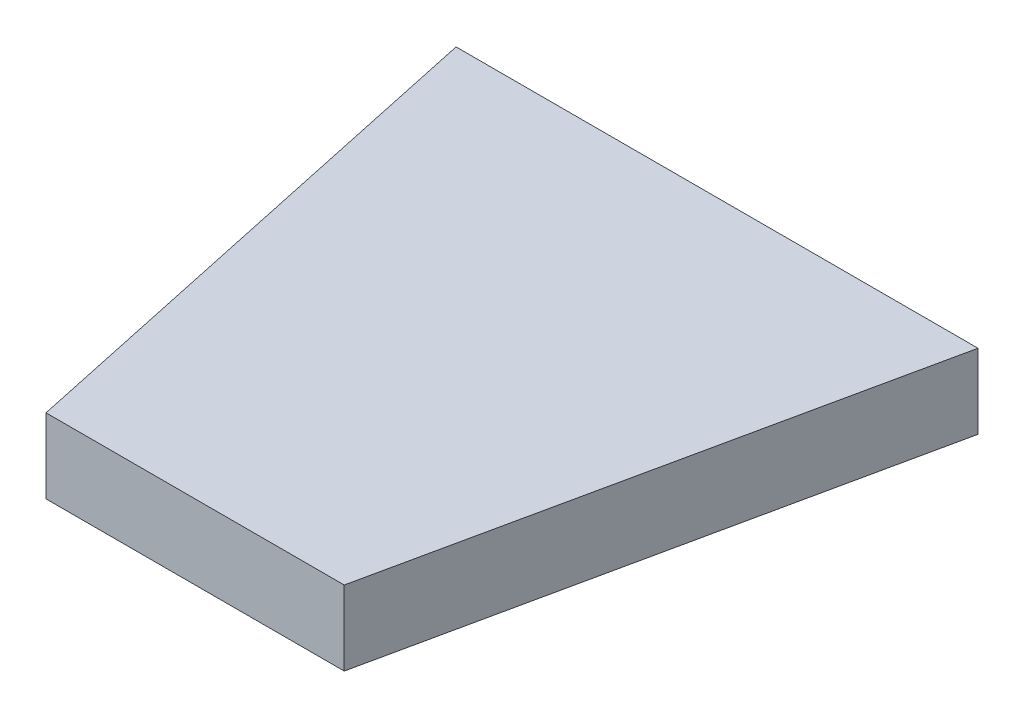
ISO-10303-21;
HEADER;
FILE_DESCRIPTION(('STEP AP214'),'2;1');
FILE_NAME('part.step','',(''),(''),'','','');
FILE_SCHEMA(('AUTOMOTIVE_DESIGN { 1 0 10303 214 1 1 1 1 }'));
ENDSEC;
DATA;
#1=APPLICATION_CONTEXT('core data for automotive mechanical design processes');
#2=APPLICATION_PROTOCOL_DEFINITION('international standard','automotive_design',2000,#1);
#3=PRODUCT_CONTEXT('',#1,'mechanical');
#4=PRODUCT('Part','Part','',(#3));
#5=PRODUCT_RELATED_PRODUCT_CATEGORY('part','',(#4));
#6=PRODUCT_DEFINITION_FORMATION('','',#4);
#7=PRODUCT_DEFINITION_CONTEXT('part definition',#1,'design');
#8=PRODUCT_DEFINITION('design','',#6,#7);
#9=PRODUCT_DEFINITION_SHAPE('','',#8);
#10=(LENGTH_UNIT() NAMED_UNIT(*) SI_UNIT(.MILLI.,.METRE.));
#11=(NAMED_UNIT(*) PLANE_ANGLE_UNIT() SI_UNIT($,.RADIAN.));
#12=(NAMED_UNIT(*) SI_UNIT($,.STERADIAN.) SOLID_ANGLE_UNIT());
#13=UNCERTAINTY_MEASURE_WITH_UNIT(LENGTH_MEASURE(1.E-05),#10,'distance_accuracy_value','');
#14=(GEOMETRIC_REPRESENTATION_CONTEXT(3) GLOBAL_UNCERTAINTY_ASSIGNED_CONTEXT((#13)) GLOBAL_UNIT_ASSIGNED_CONTEXT((#10,
#11,#12)) REPRESENTATION_CONTEXT('',''));
#15=CARTESIAN_POINT('',(0.,0.,0.));
#16=DIRECTION('',(0.,0.,1.));
#17=DIRECTION('',(1.,0.,0.));
#18=AXIS2_PLACEMENT_3D('',#15,#16,#17);
#19=CARTESIAN_POINT('',(35.,10.,-35.));
#20=DIRECTION('',(0.,0.,1.));
#21=DIRECTION('',(1.,0.,0.));
#22=AXIS2_PLACEMENT_3D('',#19,#20,#21);
#23=PLANE('',#22);
#24=DIRECTION('',(-1.,0.,0.));
#25=VECTOR('',#24,1.);
#26=CARTESIAN_POINT('',(35.,0.,-35.));
#27=LINE('',#26,#25);
#28=CARTESIAN_POINT('',(35.,0.,-35.));
#29=VERTEX_POINT('',#28);
#30=CARTESIAN_POINT('',(-35.,0.,-35.));
#31=VERTEX_POINT('',#30);
#32=EDGE_CURVE('E96',#29,#31,#27,.T.);
#33=ORIENTED_EDGE('',*,*,#32,.T.);
#34=DIRECTION('',(0.,-1.,0.));
#35=VECTOR('',#34,1.);
#36=CARTESIAN_POINT('',(-35.,10.,-35.));
#37=LINE('',#36,#35);
#38=CARTESIAN_POINT('',(-35.,10.,-35.));
#39=VERTEX_POINT('',#38);
#40=EDGE_CURVE('E11',#39,#31,#37,.T.);
#41=ORIENTED_EDGE('',*,*,#40,.F.);
#42=DIRECTION('',(-1.,0.,0.));
#43=VECTOR('',#42,1.);
#44=CARTESIAN_POINT('',(35.,10.,-35.));
#45=LINE('',#44,#43);
#46=CARTESIAN_POINT('',(35.,10.,-35.));
#47=VERTEX_POINT('',#46);
#48=EDGE_CURVE('E84',#47,#39,#45,.T.);
#49=ORIENTED_EDGE('',*,*,#48,.F.);
#50=DIRECTION('',(0.,-1.,0.));
#51=VECTOR('',#50,1.);
#52=CARTESIAN_POINT('',(35.,10.,-35.));
#53=LINE('',#52,#51);
#54=EDGE_CURVE('E92',#47,#29,#53,.T.);
#55=ORIENTED_EDGE('',*,*,#54,.T.);
#56=EDGE_LOOP('',(#33,#41,#49,#55));
#57=FACE_BOUND('',#56,.T.);
#58=ADVANCED_FACE('F33',(#57),#23,.F.);
#59=CARTESIAN_POINT('',(-35.,10.,-35.));
#60=DIRECTION('',(0.97780241407741,0.,-0.209529088730874));
#61=DIRECTION('',(-0.209529088730874,0.,-0.97780241407741));
#62=AXIS2_PLACEMENT_3D('',#59,#60,#61);
#63=PLANE('',#62);
#64=DIRECTION('',(0.209529088730874,0.,0.97780241407741));
#65=VECTOR('',#64,1.);
#66=CARTESIAN_POINT('',(-35.,0.,-35.));
#67=LINE('',#66,#65);
#68=CARTESIAN_POINT('',(-20.,0.,35.));
#69=VERTEX_POINT('',#68);
#70=EDGE_CURVE('E88',#31,#69,#67,.T.);
#71=ORIENTED_EDGE('',*,*,#70,.T.);
#72=DIRECTION('',(0.,-1.,0.));
#73=VECTOR('',#72,1.);
#74=CARTESIAN_POINT('',(-20.,10.,35.));
#75=LINE('',#74,#73);
#76=CARTESIAN_POINT('',(-20.,10.,35.));
#77=VERTEX_POINT('',#76);
#78=EDGE_CURVE('E41',#77,#69,#75,.T.);
#79=ORIENTED_EDGE('',*,*,#78,.F.);
#80=DIRECTION('',(0.209529088730874,0.,0.97780241407741));
#81=VECTOR('',#80,1.);
#82=CARTESIAN_POINT('',(-35.,10.,-35.));
#83=LINE('',#82,#81);
#84=EDGE_CURVE('E79',#39,#77,#83,.T.);
#85=ORIENTED_EDGE('',*,*,#84,.F.);
#86=ORIENTED_EDGE('',*,*,#40,.T.);
#87=EDGE_LOOP('',(#71,#79,#85,#86));
#88=FACE_BOUND('',#87,.T.);
#89=ADVANCED_FACE('F87',(#88),#63,.F.);
#90=CARTESIAN_POINT('',(-20.,10.,35.));
#91=DIRECTION('',(0.,0.,-1.));
#92=DIRECTION('',(-1.,0.,0.));
#93=AXIS2_PLACEMENT_3D('',#90,#91,#92);
#94=PLANE('',#93);
#95=DIRECTION('',(1.,0.,0.));
#96=VECTOR('',#95,1.);
#97=CARTESIAN_POINT('',(-20.,0.,35.));
#98=LINE('',#97,#96);
#99=CARTESIAN_POINT('',(20.,0.,35.));
#100=VERTEX_POINT('',#99);
#101=EDGE_CURVE('E66',#69,#100,#98,.T.);
#102=ORIENTED_EDGE('',*,*,#101,.T.);
#103=DIRECTION('',(0.,-1.,0.));
#104=VECTOR('',#103,1.);
#105=CARTESIAN_POINT('',(20.,10.,35.));
#106=LINE('',#105,#104);
#107=CARTESIAN_POINT('',(20.,10.,35.));
#108=VERTEX_POINT('',#107);
#109=EDGE_CURVE('E89',#108,#100,#106,.T.);
#110=ORIENTED_EDGE('',*,*,#109,.F.);
#111=DIRECTION('',(1.,0.,0.));
#112=VECTOR('',#111,1.);
#113=CARTESIAN_POINT('',(-20.,10.,35.));
#114=LINE('',#113,#112);
#115=EDGE_CURVE('E82',#77,#108,#114,.T.);
#116=ORIENTED_EDGE('',*,*,#115,.F.);
#117=ORIENTED_EDGE('',*,*,#78,.T.);
#118=EDGE_LOOP('',(#102,#110,#116,#117));
#119=FACE_BOUND('',#118,.T.);
#120=ADVANCED_FACE('F90',(#119),#94,.F.);
#121=CARTESIAN_POINT('',(20.,10.,35.));
#122=DIRECTION('',(-0.97780241407741,0.,-0.209529088730873));
#123=DIRECTION('',(-0.209529088730873,0.,0.97780241407741));
#124=AXIS2_PLACEMENT_3D('',#121,#122,#123);
#125=PLANE('',#124);
#126=DIRECTION('',(0.209529088730873,0.,-0.97780241407741));
#127=VECTOR('',#126,1.);
#128=CARTESIAN_POINT('',(20.,0.,35.));
#129=LINE('',#128,#127);
#130=EDGE_CURVE('E72',#100,#29,#129,.T.);
#131=ORIENTED_EDGE('',*,*,#130,.T.);
#132=ORIENTED_EDGE('',*,*,#54,.F.);
#133=DIRECTION('',(0.209529088730873,0.,-0.97780241407741));
#134=VECTOR('',#133,1.);
#135=CARTESIAN_POINT('',(20.,10.,35.));
#136=LINE('',#135,#134);
#137=EDGE_CURVE('E49',#108,#47,#136,.T.);
#138=ORIENTED_EDGE('',*,*,#137,.F.);
#139=ORIENTED_EDGE('',*,*,#109,.T.);
#140=EDGE_LOOP('',(#131,#132,#138,#139));
#141=FACE_BOUND('',#140,.T.);
#142=ADVANCED_FACE('F103',(#141),#125,.F.);
#143=CARTESIAN_POINT('',(0.,10.,0.));
#144=DIRECTION('',(0.,1.,0.));
#145=DIRECTION('',(0.,0.,1.));
#146=AXIS2_PLACEMENT_3D('',#143,#144,#145);
#147=PLANE('',#146);
#148=ORIENTED_EDGE('',*,*,#48,.T.);
#149=ORIENTED_EDGE('',*,*,#84,.T.);
#150=ORIENTED_EDGE('',*,*,#115,.T.);
#151=ORIENTED_EDGE('',*,*,#137,.T.);
#152=EDGE_LOOP('',(#148,#149,#150,#151));
#153=FACE_BOUND('',#152,.T.);
#154=ADVANCED_FACE('F80',(#153),#147,.T.);
#155=CARTESIAN_POINT('',(0.,0.,0.));
#156=DIRECTION('',(0.,1.,0.));
#157=DIRECTION('',(0.,0.,1.));
#158=AXIS2_PLACEMENT_3D('',#155,#156,#157);
#159=PLANE('',#158);
#160=ORIENTED_EDGE('',*,*,#32,.F.);
#161=ORIENTED_EDGE('',*,*,#130,.F.);
#162=ORIENTED_EDGE('',*,*,#101,.F.);
#163=ORIENTED_EDGE('',*,*,#70,.F.);
#164=EDGE_LOOP('',(#160,#161,#162,#163));
#165=FACE_BOUND('',#164,.T.);
#166=ADVANCED_FACE('F106',(#165),#159,.F.);
#167=CLOSED_SHELL('',(#58,#89,#120,#142,#154,#166));
#168=MANIFOLD_SOLID_BREP('B2',#167);
#169=ADVANCED_BREP_SHAPE_REPRESENTATION('',(#18,#168),#14);
#170=SHAPE_DEFINITION_REPRESENTATION(#9,#169);
ENDSEC;
END-ISO-10303-21;
